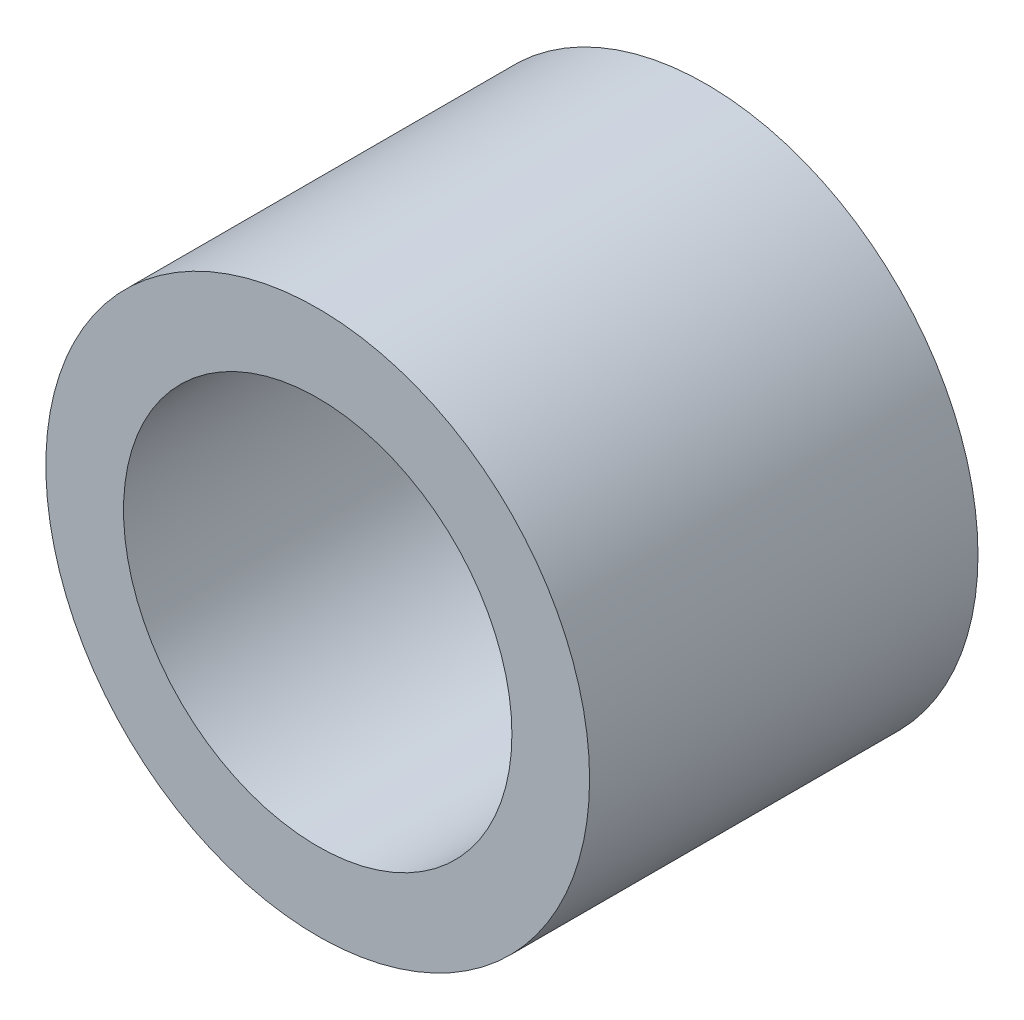
ISO-10303-21;
HEADER;
FILE_DESCRIPTION(('STEP AP214'),'2;1');
FILE_NAME('part.step','',(''),(''),'','','');
FILE_SCHEMA(('AUTOMOTIVE_DESIGN { 1 0 10303 214 1 1 1 1 }'));
ENDSEC;
DATA;
#1=APPLICATION_CONTEXT('core data for automotive mechanical design processes');
#2=APPLICATION_PROTOCOL_DEFINITION('international standard','automotive_design',2000,#1);
#3=PRODUCT_CONTEXT('',#1,'mechanical');
#4=PRODUCT('Part','Part','',(#3));
#5=PRODUCT_RELATED_PRODUCT_CATEGORY('part','',(#4));
#6=PRODUCT_DEFINITION_FORMATION('','',#4);
#7=PRODUCT_DEFINITION_CONTEXT('part definition',#1,'design');
#8=PRODUCT_DEFINITION('design','',#6,#7);
#9=PRODUCT_DEFINITION_SHAPE('','',#8);
#10=(LENGTH_UNIT() NAMED_UNIT(*) SI_UNIT(.MILLI.,.METRE.));
#11=(NAMED_UNIT(*) PLANE_ANGLE_UNIT() SI_UNIT($,.RADIAN.));
#12=(NAMED_UNIT(*) SI_UNIT($,.STERADIAN.) SOLID_ANGLE_UNIT());
#13=UNCERTAINTY_MEASURE_WITH_UNIT(LENGTH_MEASURE(1.E-05),#10,'distance_accuracy_value','');
#14=(GEOMETRIC_REPRESENTATION_CONTEXT(3) GLOBAL_UNCERTAINTY_ASSIGNED_CONTEXT((#13)) GLOBAL_UNIT_ASSIGNED_CONTEXT((#10,
#11,#12)) REPRESENTATION_CONTEXT('',''));
#15=CARTESIAN_POINT('',(0.,0.,0.));
#16=DIRECTION('',(0.,0.,1.));
#17=DIRECTION('',(1.,0.,0.));
#18=AXIS2_PLACEMENT_3D('',#15,#16,#17);
#19=CARTESIAN_POINT('',(0.,0.,6.35));
#20=DIRECTION('',(0.,0.,1.));
#21=DIRECTION('',(1.,0.,0.));
#22=AXIS2_PLACEMENT_3D('',#19,#20,#21);
#23=PLANE('',#22);
#24=CARTESIAN_POINT('',(0.,0.,6.35));
#25=DIRECTION('',(0.,0.,1.));
#26=DIRECTION('',(1.,0.,0.));
#27=AXIS2_PLACEMENT_3D('',#24,#25,#26);
#28=CIRCLE('',#27,4.445);
#29=CARTESIAN_POINT('',(4.445,0.,6.35));
#30=VERTEX_POINT('',#29);
#31=EDGE_CURVE('E10',#30,#30,#28,.T.);
#32=ORIENTED_EDGE('',*,*,#31,.T.);
#33=EDGE_LOOP('',(#32));
#34=FACE_BOUND('',#33,.T.);
#35=CARTESIAN_POINT('',(0.,0.,6.35));
#36=DIRECTION('',(0.,0.,1.));
#37=DIRECTION('',(1.,0.,0.));
#38=AXIS2_PLACEMENT_3D('',#35,#36,#37);
#39=CIRCLE('',#38,3.175);
#40=CARTESIAN_POINT('',(3.175,0.,6.35));
#41=VERTEX_POINT('',#40);
#42=EDGE_CURVE('E56',#41,#41,#39,.T.);
#43=ORIENTED_EDGE('',*,*,#42,.F.);
#44=EDGE_LOOP('',(#43));
#45=FACE_BOUND('',#44,.T.);
#46=ADVANCED_FACE('F43',(#34,#45),#23,.T.);
#47=CARTESIAN_POINT('',(0.,0.,0.));
#48=DIRECTION('',(0.,0.,1.));
#49=DIRECTION('',(1.,0.,0.));
#50=AXIS2_PLACEMENT_3D('',#47,#48,#49);
#51=PLANE('',#50);
#52=CARTESIAN_POINT('',(0.,0.,0.));
#53=DIRECTION('',(0.,0.,1.));
#54=DIRECTION('',(1.,0.,0.));
#55=AXIS2_PLACEMENT_3D('',#52,#53,#54);
#56=CIRCLE('',#55,4.445);
#57=CARTESIAN_POINT('',(4.445,0.,0.));
#58=VERTEX_POINT('',#57);
#59=EDGE_CURVE('E47',#58,#58,#56,.T.);
#60=ORIENTED_EDGE('',*,*,#59,.F.);
#61=EDGE_LOOP('',(#60));
#62=FACE_BOUND('',#61,.T.);
#63=CARTESIAN_POINT('',(0.,0.,0.));
#64=DIRECTION('',(0.,0.,1.));
#65=DIRECTION('',(1.,0.,0.));
#66=AXIS2_PLACEMENT_3D('',#63,#64,#65);
#67=CIRCLE('',#66,3.175);
#68=CARTESIAN_POINT('',(3.175,0.,0.));
#69=VERTEX_POINT('',#68);
#70=EDGE_CURVE('E58',#69,#69,#67,.T.);
#71=ORIENTED_EDGE('',*,*,#70,.T.);
#72=EDGE_LOOP('',(#71));
#73=FACE_BOUND('',#72,.T.);
#74=ADVANCED_FACE('F70',(#62,#73),#51,.F.);
#75=CARTESIAN_POINT('',(0.,0.,6.35));
#76=DIRECTION('',(0.,0.,-1.));
#77=DIRECTION('',(-1.,0.,0.));
#78=AXIS2_PLACEMENT_3D('',#75,#76,#77);
#79=CYLINDRICAL_SURFACE('',#78,4.445);
#80=ORIENTED_EDGE('',*,*,#31,.F.);
#81=EDGE_LOOP('',(#80));
#82=FACE_BOUND('',#81,.T.);
#83=ORIENTED_EDGE('',*,*,#59,.T.);
#84=EDGE_LOOP('',(#83));
#85=FACE_BOUND('',#84,.T.);
#86=ADVANCED_FACE('F45',(#82,#85),#79,.T.);
#87=CARTESIAN_POINT('',(0.,0.,6.35));
#88=DIRECTION('',(0.,0.,-1.));
#89=DIRECTION('',(-1.,0.,0.));
#90=AXIS2_PLACEMENT_3D('',#87,#88,#89);
#91=CYLINDRICAL_SURFACE('',#90,3.175);
#92=ORIENTED_EDGE('',*,*,#42,.T.);
#93=EDGE_LOOP('',(#92));
#94=FACE_BOUND('',#93,.T.);
#95=ORIENTED_EDGE('',*,*,#70,.F.);
#96=EDGE_LOOP('',(#95));
#97=FACE_BOUND('',#96,.T.);
#98=ADVANCED_FACE('F66',(#94,#97),#91,.F.);
#99=CLOSED_SHELL('',(#46,#74,#86,#98));
#100=MANIFOLD_SOLID_BREP('B2',#99);
#101=ADVANCED_BREP_SHAPE_REPRESENTATION('',(#18,#100),#14);
#102=SHAPE_DEFINITION_REPRESENTATION(#9,#101);
ENDSEC;
END-ISO-10303-21;
